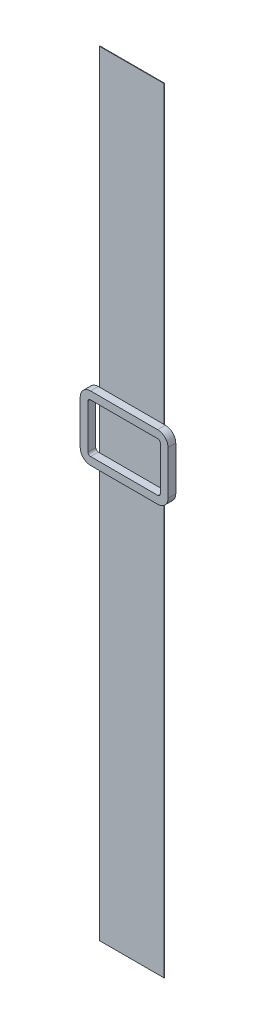
ISO-10303-21;
HEADER;
FILE_DESCRIPTION(('STEP AP214'),'2;1');
FILE_NAME('part.step','',(''),(''),'','','');
FILE_SCHEMA(('AUTOMOTIVE_DESIGN { 1 0 10303 214 1 1 1 1 }'));
ENDSEC;
DATA;
#1=APPLICATION_CONTEXT('core data for automotive mechanical design processes');
#2=APPLICATION_PROTOCOL_DEFINITION('international standard','automotive_design',2000,#1);
#3=PRODUCT_CONTEXT('',#1,'mechanical');
#4=PRODUCT('Part','Part','',(#3));
#5=PRODUCT_RELATED_PRODUCT_CATEGORY('part','',(#4));
#6=PRODUCT_DEFINITION_FORMATION('','',#4);
#7=PRODUCT_DEFINITION_CONTEXT('part definition',#1,'design');
#8=PRODUCT_DEFINITION('design','',#6,#7);
#9=PRODUCT_DEFINITION_SHAPE('','',#8);
#10=(LENGTH_UNIT() NAMED_UNIT(*) SI_UNIT(.MILLI.,.METRE.));
#11=(NAMED_UNIT(*) PLANE_ANGLE_UNIT() SI_UNIT($,.RADIAN.));
#12=(NAMED_UNIT(*) SI_UNIT($,.STERADIAN.) SOLID_ANGLE_UNIT());
#13=UNCERTAINTY_MEASURE_WITH_UNIT(LENGTH_MEASURE(1.E-05),#10,'distance_accuracy_value','');
#14=(GEOMETRIC_REPRESENTATION_CONTEXT(3) GLOBAL_UNCERTAINTY_ASSIGNED_CONTEXT((#13)) GLOBAL_UNIT_ASSIGNED_CONTEXT((#10,
#11,#12)) REPRESENTATION_CONTEXT('',''));
#15=CARTESIAN_POINT('',(0.,0.,0.));
#16=DIRECTION('',(0.,0.,1.));
#17=DIRECTION('',(1.,0.,0.));
#18=AXIS2_PLACEMENT_3D('',#15,#16,#17);
#19=CARTESIAN_POINT('',(0.,300.,0.2));
#20=DIRECTION('',(0.,0.,-1.));
#21=DIRECTION('',(-1.,0.,0.));
#22=AXIS2_PLACEMENT_3D('',#19,#20,#21);
#23=PLANE('',#22);
#24=DIRECTION('',(-1.,0.,0.));
#25=VECTOR('',#24,1.);
#26=CARTESIAN_POINT('',(-0.499999999999997,185.652949425216,0.2));
#27=LINE('',#26,#25);
#28=CARTESIAN_POINT('',(25.,185.652949425217,0.2));
#29=VERTEX_POINT('',#28);
#30=CARTESIAN_POINT('',(0.,185.652949425216,0.2));
#31=VERTEX_POINT('',#30);
#32=EDGE_CURVE('E11',#29,#31,#27,.T.);
#33=ORIENTED_EDGE('',*,*,#32,.F.);
#34=DIRECTION('',(0.,1.,0.));
#35=VECTOR('',#34,1.);
#36=CARTESIAN_POINT('',(25.,0.,0.2));
#37=LINE('',#36,#35);
#38=CARTESIAN_POINT('',(25.,300.,0.2));
#39=VERTEX_POINT('',#38);
#40=EDGE_CURVE('E337',#29,#39,#37,.T.);
#41=ORIENTED_EDGE('',*,*,#40,.T.);
#42=DIRECTION('',(-1.,0.,0.));
#43=VECTOR('',#42,1.);
#44=CARTESIAN_POINT('',(0.,300.,0.2));
#45=LINE('',#44,#43);
#46=CARTESIAN_POINT('',(0.,300.,0.2));
#47=VERTEX_POINT('',#46);
#48=EDGE_CURVE('E341',#39,#47,#45,.T.);
#49=ORIENTED_EDGE('',*,*,#48,.T.);
#50=DIRECTION('',(0.,-1.,0.));
#51=VECTOR('',#50,1.);
#52=CARTESIAN_POINT('',(0.,0.,0.2));
#53=LINE('',#52,#51);
#54=EDGE_CURVE('E330',#47,#31,#53,.T.);
#55=ORIENTED_EDGE('',*,*,#54,.T.);
#56=EDGE_LOOP('',(#33,#41,#49,#55));
#57=FACE_BOUND('',#56,.T.);
#58=ADVANCED_FACE('F32',(#57),#23,.F.);
#59=DIRECTION('',(1.,0.,0.));
#60=VECTOR('',#59,1.);
#61=CARTESIAN_POINT('',(-0.5,160.652949425216,0.2));
#62=LINE('',#61,#60);
#63=CARTESIAN_POINT('',(0.,160.652949425216,0.2));
#64=VERTEX_POINT('',#63);
#65=CARTESIAN_POINT('',(25.,160.652949425217,0.2));
#66=VERTEX_POINT('',#65);
#67=EDGE_CURVE('E41',#64,#66,#62,.T.);
#68=ORIENTED_EDGE('',*,*,#67,.F.);
#69=CARTESIAN_POINT('',(0.,0.,0.2));
#70=VERTEX_POINT('',#69);
#71=EDGE_CURVE('E335',#64,#70,#53,.T.);
#72=ORIENTED_EDGE('',*,*,#71,.T.);
#73=DIRECTION('',(1.,0.,0.));
#74=VECTOR('',#73,1.);
#75=CARTESIAN_POINT('',(0.,0.,0.2));
#76=LINE('',#75,#74);
#77=CARTESIAN_POINT('',(25.,0.,0.2));
#78=VERTEX_POINT('',#77);
#79=EDGE_CURVE('E333',#70,#78,#76,.T.);
#80=ORIENTED_EDGE('',*,*,#79,.T.);
#81=EDGE_CURVE('E338',#78,#66,#37,.T.);
#82=ORIENTED_EDGE('',*,*,#81,.T.);
#83=EDGE_LOOP('',(#68,#72,#80,#82));
#84=FACE_BOUND('',#83,.T.);
#85=ADVANCED_FACE('F430',(#84),#23,.F.);
#86=CARTESIAN_POINT('',(0.,0.,0.2));
#87=DIRECTION('',(1.,0.,0.));
#88=DIRECTION('',(0.,0.,-1.));
#89=AXIS2_PLACEMENT_3D('',#86,#87,#88);
#90=PLANE('',#89);
#91=DIRECTION('',(0.,-1.,0.));
#92=VECTOR('',#91,1.);
#93=CARTESIAN_POINT('',(0.,0.,0.));
#94=LINE('',#93,#92);
#95=CARTESIAN_POINT('',(0.,300.,0.));
#96=VERTEX_POINT('',#95);
#97=CARTESIAN_POINT('',(0.,0.,0.));
#98=VERTEX_POINT('',#97);
#99=EDGE_CURVE('E329',#96,#98,#94,.T.);
#100=ORIENTED_EDGE('',*,*,#99,.T.);
#101=DIRECTION('',(0.,0.,-1.));
#102=VECTOR('',#101,1.);
#103=CARTESIAN_POINT('',(0.,0.,0.2));
#104=LINE('',#103,#102);
#105=EDGE_CURVE('E36',#70,#98,#104,.T.);
#106=ORIENTED_EDGE('',*,*,#105,.F.);
#107=ORIENTED_EDGE('',*,*,#71,.F.);
#108=CARTESIAN_POINT('',(0.,163.652949425216,0.2));
#109=VERTEX_POINT('',#108);
#110=EDGE_CURVE('E401',#109,#64,#53,.T.);
#111=ORIENTED_EDGE('',*,*,#110,.F.);
#112=CARTESIAN_POINT('',(0.,182.652949425216,0.2));
#113=VERTEX_POINT('',#112);
#114=EDGE_CURVE('E404',#113,#109,#53,.T.);
#115=ORIENTED_EDGE('',*,*,#114,.F.);
#116=EDGE_CURVE('E334',#31,#113,#53,.T.);
#117=ORIENTED_EDGE('',*,*,#116,.F.);
#118=ORIENTED_EDGE('',*,*,#54,.F.);
#119=DIRECTION('',(0.,0.,-1.));
#120=VECTOR('',#119,1.);
#121=CARTESIAN_POINT('',(0.,300.,0.2));
#122=LINE('',#121,#120);
#123=EDGE_CURVE('E344',#47,#96,#122,.T.);
#124=ORIENTED_EDGE('',*,*,#123,.T.);
#125=EDGE_LOOP('',(#100,#106,#107,#111,#115,#117,#118,#124));
#126=FACE_BOUND('',#125,.T.);
#127=ADVANCED_FACE('F34',(#126),#90,.F.);
#128=CARTESIAN_POINT('',(0.,0.,0.2));
#129=DIRECTION('',(0.,1.,0.));
#130=DIRECTION('',(0.,0.,1.));
#131=AXIS2_PLACEMENT_3D('',#128,#129,#130);
#132=PLANE('',#131);
#133=DIRECTION('',(1.,0.,0.));
#134=VECTOR('',#133,1.);
#135=CARTESIAN_POINT('',(0.,0.,0.));
#136=LINE('',#135,#134);
#137=CARTESIAN_POINT('',(25.,0.,0.));
#138=VERTEX_POINT('',#137);
#139=EDGE_CURVE('E347',#98,#138,#136,.T.);
#140=ORIENTED_EDGE('',*,*,#139,.T.);
#141=DIRECTION('',(0.,0.,-1.));
#142=VECTOR('',#141,1.);
#143=CARTESIAN_POINT('',(25.,0.,0.2));
#144=LINE('',#143,#142);
#145=EDGE_CURVE('E357',#78,#138,#144,.T.);
#146=ORIENTED_EDGE('',*,*,#145,.F.);
#147=ORIENTED_EDGE('',*,*,#79,.F.);
#148=ORIENTED_EDGE('',*,*,#105,.T.);
#149=EDGE_LOOP('',(#140,#146,#147,#148));
#150=FACE_BOUND('',#149,.T.);
#151=ADVANCED_FACE('F427',(#150),#132,.F.);
#152=CARTESIAN_POINT('',(25.,0.,0.2));
#153=DIRECTION('',(-1.,0.,0.));
#154=DIRECTION('',(0.,0.,1.));
#155=AXIS2_PLACEMENT_3D('',#152,#153,#154);
#156=PLANE('',#155);
#157=DIRECTION('',(0.,1.,0.));
#158=VECTOR('',#157,1.);
#159=CARTESIAN_POINT('',(25.,0.,0.));
#160=LINE('',#159,#158);
#161=CARTESIAN_POINT('',(25.,300.,0.));
#162=VERTEX_POINT('',#161);
#163=EDGE_CURVE('E349',#138,#162,#160,.T.);
#164=ORIENTED_EDGE('',*,*,#163,.T.);
#165=DIRECTION('',(0.,0.,-1.));
#166=VECTOR('',#165,1.);
#167=CARTESIAN_POINT('',(25.,300.,0.2));
#168=LINE('',#167,#166);
#169=EDGE_CURVE('E355',#39,#162,#168,.T.);
#170=ORIENTED_EDGE('',*,*,#169,.F.);
#171=ORIENTED_EDGE('',*,*,#40,.F.);
#172=CARTESIAN_POINT('',(25.,182.652949425217,0.2));
#173=VERTEX_POINT('',#172);
#174=EDGE_CURVE('E412',#173,#29,#37,.T.);
#175=ORIENTED_EDGE('',*,*,#174,.F.);
#176=CARTESIAN_POINT('',(25.,163.652949425217,0.2));
#177=VERTEX_POINT('',#176);
#178=EDGE_CURVE('E407',#177,#173,#37,.T.);
#179=ORIENTED_EDGE('',*,*,#178,.F.);
#180=EDGE_CURVE('E342',#66,#177,#37,.T.);
#181=ORIENTED_EDGE('',*,*,#180,.F.);
#182=ORIENTED_EDGE('',*,*,#81,.F.);
#183=ORIENTED_EDGE('',*,*,#145,.T.);
#184=EDGE_LOOP('',(#164,#170,#171,#175,#179,#181,#182,#183));
#185=FACE_BOUND('',#184,.T.);
#186=ADVANCED_FACE('F410',(#185),#156,.F.);
#187=CARTESIAN_POINT('',(0.,300.,0.2));
#188=DIRECTION('',(0.,-1.,0.));
#189=DIRECTION('',(0.,0.,-1.));
#190=AXIS2_PLACEMENT_3D('',#187,#188,#189);
#191=PLANE('',#190);
#192=DIRECTION('',(-1.,0.,0.));
#193=VECTOR('',#192,1.);
#194=CARTESIAN_POINT('',(0.,300.,0.));
#195=LINE('',#194,#193);
#196=EDGE_CURVE('E351',#162,#96,#195,.T.);
#197=ORIENTED_EDGE('',*,*,#196,.T.);
#198=ORIENTED_EDGE('',*,*,#123,.F.);
#199=ORIENTED_EDGE('',*,*,#48,.F.);
#200=ORIENTED_EDGE('',*,*,#169,.T.);
#201=EDGE_LOOP('',(#197,#198,#199,#200));
#202=FACE_BOUND('',#201,.T.);
#203=ADVANCED_FACE('F422',(#202),#191,.F.);
#204=ORIENTED_EDGE('',*,*,#114,.T.);
#205=DIRECTION('',(1.,0.,0.));
#206=VECTOR('',#205,1.);
#207=CARTESIAN_POINT('',(-0.5,163.652949425216,0.2));
#208=LINE('',#207,#206);
#209=EDGE_CURVE('E247',#109,#177,#208,.T.);
#210=ORIENTED_EDGE('',*,*,#209,.T.);
#211=ORIENTED_EDGE('',*,*,#178,.T.);
#212=DIRECTION('',(-1.,0.,0.));
#213=VECTOR('',#212,1.);
#214=CARTESIAN_POINT('',(-0.5,182.652949425216,0.2));
#215=LINE('',#214,#213);
#216=EDGE_CURVE('E258',#173,#113,#215,.T.);
#217=ORIENTED_EDGE('',*,*,#216,.T.);
#218=EDGE_LOOP('',(#204,#210,#211,#217));
#219=FACE_BOUND('',#218,.T.);
#220=ADVANCED_FACE('F405',(#219),#23,.F.);
#221=CARTESIAN_POINT('',(0.,300.,0.));
#222=DIRECTION('',(0.,0.,-1.));
#223=DIRECTION('',(-1.,0.,0.));
#224=AXIS2_PLACEMENT_3D('',#221,#222,#223);
#225=PLANE('',#224);
#226=ORIENTED_EDGE('',*,*,#99,.F.);
#227=ORIENTED_EDGE('',*,*,#196,.F.);
#228=ORIENTED_EDGE('',*,*,#163,.F.);
#229=ORIENTED_EDGE('',*,*,#139,.F.);
#230=EDGE_LOOP('',(#226,#227,#228,#229));
#231=FACE_BOUND('',#230,.T.);
#232=ADVANCED_FACE('F426',(#231),#225,.T.);
#233=CARTESIAN_POINT('',(-0.5,181.652949425216,0.2));
#234=DIRECTION('',(0.,0.,1.));
#235=DIRECTION('',(1.,0.,0.));
#236=AXIS2_PLACEMENT_3D('',#233,#234,#235);
#237=PLANE('',#236);
#238=CARTESIAN_POINT('',(-0.499999999999997,185.652949425216,0.2));
#239=VERTEX_POINT('',#238);
#240=EDGE_CURVE('E44',#31,#239,#27,.T.);
#241=ORIENTED_EDGE('',*,*,#240,.F.);
#242=ORIENTED_EDGE('',*,*,#116,.T.);
#243=CARTESIAN_POINT('',(-0.5,182.652949425216,0.2));
#244=VERTEX_POINT('',#243);
#245=EDGE_CURVE('E59',#113,#244,#215,.T.);
#246=ORIENTED_EDGE('',*,*,#245,.T.);
#247=CARTESIAN_POINT('',(-0.5,181.652949425216,0.2));
#248=DIRECTION('',(0.,0.,1.));
#249=DIRECTION('',(1.,0.,0.));
#250=AXIS2_PLACEMENT_3D('',#247,#248,#249);
#251=CIRCLE('',#250,1.);
#252=CARTESIAN_POINT('',(-1.5,181.652949425216,0.2));
#253=VERTEX_POINT('',#252);
#254=EDGE_CURVE('E237',#244,#253,#251,.T.);
#255=ORIENTED_EDGE('',*,*,#254,.T.);
#256=DIRECTION('',(0.,-1.,0.));
#257=VECTOR('',#256,1.);
#258=CARTESIAN_POINT('',(-1.5,181.652949425216,0.2));
#259=LINE('',#258,#257);
#260=CARTESIAN_POINT('',(-1.5,164.652949425216,0.2));
#261=VERTEX_POINT('',#260);
#262=EDGE_CURVE('E215',#253,#261,#259,.T.);
#263=ORIENTED_EDGE('',*,*,#262,.T.);
#264=CARTESIAN_POINT('',(-0.5,164.652949425216,0.2));
#265=DIRECTION('',(0.,0.,1.));
#266=DIRECTION('',(1.,0.,0.));
#267=AXIS2_PLACEMENT_3D('',#264,#265,#266);
#268=CIRCLE('',#267,1.);
#269=CARTESIAN_POINT('',(-0.5,163.652949425216,0.2));
#270=VERTEX_POINT('',#269);
#271=EDGE_CURVE('E240',#261,#270,#268,.T.);
#272=ORIENTED_EDGE('',*,*,#271,.T.);
#273=EDGE_CURVE('E243',#270,#109,#208,.T.);
#274=ORIENTED_EDGE('',*,*,#273,.T.);
#275=ORIENTED_EDGE('',*,*,#110,.T.);
#276=CARTESIAN_POINT('',(-0.5,160.652949425216,0.2));
#277=VERTEX_POINT('',#276);
#278=EDGE_CURVE('E296',#277,#64,#62,.T.);
#279=ORIENTED_EDGE('',*,*,#278,.F.);
#280=CARTESIAN_POINT('',(-0.5,164.652949425216,0.2));
#281=DIRECTION('',(0.,0.,1.));
#282=DIRECTION('',(1.,0.,0.));
#283=AXIS2_PLACEMENT_3D('',#280,#281,#282);
#284=CIRCLE('',#283,4.);
#285=CARTESIAN_POINT('',(-4.5,164.652949425216,0.2));
#286=VERTEX_POINT('',#285);
#287=EDGE_CURVE('E293',#286,#277,#284,.T.);
#288=ORIENTED_EDGE('',*,*,#287,.F.);
#289=DIRECTION('',(0.,-1.,0.));
#290=VECTOR('',#289,1.);
#291=CARTESIAN_POINT('',(-4.5,181.652949425216,0.2));
#292=LINE('',#291,#290);
#293=CARTESIAN_POINT('',(-4.5,181.652949425216,0.2));
#294=VERTEX_POINT('',#293);
#295=EDGE_CURVE('E291',#294,#286,#292,.T.);
#296=ORIENTED_EDGE('',*,*,#295,.F.);
#297=CARTESIAN_POINT('',(-0.5,181.652949425216,0.2));
#298=DIRECTION('',(0.,0.,1.));
#299=DIRECTION('',(1.,0.,0.));
#300=AXIS2_PLACEMENT_3D('',#297,#298,#299);
#301=CIRCLE('',#300,4.);
#302=EDGE_CURVE('E216',#239,#294,#301,.T.);
#303=ORIENTED_EDGE('',*,*,#302,.F.);
#304=EDGE_LOOP('',(#241,#242,#246,#255,#263,#272,#274,#275,#279,#288,#296,#303));
#305=FACE_BOUND('',#304,.T.);
#306=ADVANCED_FACE('F374',(#305),#237,.F.);
#307=CARTESIAN_POINT('',(25.5,160.652949425217,0.2));
#308=VERTEX_POINT('',#307);
#309=EDGE_CURVE('E295',#66,#308,#62,.T.);
#310=ORIENTED_EDGE('',*,*,#309,.F.);
#311=ORIENTED_EDGE('',*,*,#180,.T.);
#312=CARTESIAN_POINT('',(25.5,163.652949425217,0.2));
#313=VERTEX_POINT('',#312);
#314=EDGE_CURVE('E51',#177,#313,#208,.T.);
#315=ORIENTED_EDGE('',*,*,#314,.T.);
#316=CARTESIAN_POINT('',(25.5,164.652949425217,0.2));
#317=DIRECTION('',(0.,0.,1.));
#318=DIRECTION('',(-1.,0.,0.));
#319=AXIS2_PLACEMENT_3D('',#316,#317,#318);
#320=CIRCLE('',#319,1.);
#321=CARTESIAN_POINT('',(26.5,164.652949425217,0.2));
#322=VERTEX_POINT('',#321);
#323=EDGE_CURVE('E246',#313,#322,#320,.T.);
#324=ORIENTED_EDGE('',*,*,#323,.T.);
#325=DIRECTION('',(0.,1.,0.));
#326=VECTOR('',#325,1.);
#327=CARTESIAN_POINT('',(26.5,181.652949425217,0.2));
#328=LINE('',#327,#326);
#329=CARTESIAN_POINT('',(26.5,181.652949425217,0.2));
#330=VERTEX_POINT('',#329);
#331=EDGE_CURVE('E250',#322,#330,#328,.T.);
#332=ORIENTED_EDGE('',*,*,#331,.T.);
#333=CARTESIAN_POINT('',(25.5,181.652949425217,0.2));
#334=DIRECTION('',(0.,0.,1.));
#335=DIRECTION('',(-1.,0.,0.));
#336=AXIS2_PLACEMENT_3D('',#333,#334,#335);
#337=CIRCLE('',#336,1.);
#338=CARTESIAN_POINT('',(25.5,182.652949425217,0.2));
#339=VERTEX_POINT('',#338);
#340=EDGE_CURVE('E253',#330,#339,#337,.T.);
#341=ORIENTED_EDGE('',*,*,#340,.T.);
#342=EDGE_CURVE('E209',#339,#173,#215,.T.);
#343=ORIENTED_EDGE('',*,*,#342,.T.);
#344=ORIENTED_EDGE('',*,*,#174,.T.);
#345=CARTESIAN_POINT('',(25.5,185.652949425217,0.2));
#346=VERTEX_POINT('',#345);
#347=EDGE_CURVE('E43',#346,#29,#27,.T.);
#348=ORIENTED_EDGE('',*,*,#347,.F.);
#349=CARTESIAN_POINT('',(25.5,181.652949425217,0.2));
#350=DIRECTION('',(0.,0.,1.));
#351=DIRECTION('',(-1.,0.,0.));
#352=AXIS2_PLACEMENT_3D('',#349,#350,#351);
#353=CIRCLE('',#352,4.);
#354=CARTESIAN_POINT('',(29.5,181.652949425217,0.2));
#355=VERTEX_POINT('',#354);
#356=EDGE_CURVE('E303',#355,#346,#353,.T.);
#357=ORIENTED_EDGE('',*,*,#356,.F.);
#358=DIRECTION('',(0.,1.,0.));
#359=VECTOR('',#358,1.);
#360=CARTESIAN_POINT('',(29.5,181.652949425217,0.2));
#361=LINE('',#360,#359);
#362=CARTESIAN_POINT('',(29.5,164.652949425217,0.2));
#363=VERTEX_POINT('',#362);
#364=EDGE_CURVE('E301',#363,#355,#361,.T.);
#365=ORIENTED_EDGE('',*,*,#364,.F.);
#366=CARTESIAN_POINT('',(25.5,164.652949425217,0.2));
#367=DIRECTION('',(0.,0.,1.));
#368=DIRECTION('',(-1.,0.,0.));
#369=AXIS2_PLACEMENT_3D('',#366,#367,#368);
#370=CIRCLE('',#369,4.);
#371=EDGE_CURVE('E299',#308,#363,#370,.T.);
#372=ORIENTED_EDGE('',*,*,#371,.F.);
#373=EDGE_LOOP('',(#310,#311,#315,#324,#332,#341,#343,#344,#348,#357,#365,#372));
#374=FACE_BOUND('',#373,.T.);
#375=ADVANCED_FACE('F442',(#374),#237,.F.);
#376=CARTESIAN_POINT('',(-0.5,181.652949425216,3.2));
#377=DIRECTION('',(0.,0.,1.));
#378=DIRECTION('',(1.,0.,0.));
#379=AXIS2_PLACEMENT_3D('',#376,#377,#378);
#380=PLANE('',#379);
#381=CARTESIAN_POINT('',(-0.5,181.652949425216,3.2));
#382=DIRECTION('',(0.,0.,1.));
#383=DIRECTION('',(1.,0.,0.));
#384=AXIS2_PLACEMENT_3D('',#381,#382,#383);
#385=CIRCLE('',#384,4.);
#386=CARTESIAN_POINT('',(-0.499999999999997,185.652949425216,3.2));
#387=VERTEX_POINT('',#386);
#388=CARTESIAN_POINT('',(-4.5,181.652949425216,3.2));
#389=VERTEX_POINT('',#388);
#390=EDGE_CURVE('E271',#387,#389,#385,.T.);
#391=ORIENTED_EDGE('',*,*,#390,.T.);
#392=DIRECTION('',(0.,-1.,0.));
#393=VECTOR('',#392,1.);
#394=CARTESIAN_POINT('',(-4.5,181.652949425216,3.2));
#395=LINE('',#394,#393);
#396=CARTESIAN_POINT('',(-4.5,164.652949425216,3.2));
#397=VERTEX_POINT('',#396);
#398=EDGE_CURVE('E274',#389,#397,#395,.T.);
#399=ORIENTED_EDGE('',*,*,#398,.T.);
#400=CARTESIAN_POINT('',(-0.5,164.652949425216,3.2));
#401=DIRECTION('',(0.,0.,1.));
#402=DIRECTION('',(1.,0.,0.));
#403=AXIS2_PLACEMENT_3D('',#400,#401,#402);
#404=CIRCLE('',#403,4.);
#405=CARTESIAN_POINT('',(-0.5,160.652949425216,3.2));
#406=VERTEX_POINT('',#405);
#407=EDGE_CURVE('E276',#397,#406,#404,.T.);
#408=ORIENTED_EDGE('',*,*,#407,.T.);
#409=DIRECTION('',(1.,0.,0.));
#410=VECTOR('',#409,1.);
#411=CARTESIAN_POINT('',(-0.5,160.652949425216,3.2));
#412=LINE('',#411,#410);
#413=CARTESIAN_POINT('',(25.5,160.652949425217,3.2));
#414=VERTEX_POINT('',#413);
#415=EDGE_CURVE('E278',#406,#414,#412,.T.);
#416=ORIENTED_EDGE('',*,*,#415,.T.);
#417=CARTESIAN_POINT('',(25.5,164.652949425217,3.2));
#418=DIRECTION('',(0.,0.,1.));
#419=DIRECTION('',(-1.,0.,0.));
#420=AXIS2_PLACEMENT_3D('',#417,#418,#419);
#421=CIRCLE('',#420,4.);
#422=CARTESIAN_POINT('',(29.5,164.652949425217,3.2));
#423=VERTEX_POINT('',#422);
#424=EDGE_CURVE('E280',#414,#423,#421,.T.);
#425=ORIENTED_EDGE('',*,*,#424,.T.);
#426=DIRECTION('',(0.,1.,0.));
#427=VECTOR('',#426,1.);
#428=CARTESIAN_POINT('',(29.5,181.652949425217,3.2));
#429=LINE('',#428,#427);
#430=CARTESIAN_POINT('',(29.5,181.652949425217,3.2));
#431=VERTEX_POINT('',#430);
#432=EDGE_CURVE('E282',#423,#431,#429,.T.);
#433=ORIENTED_EDGE('',*,*,#432,.T.);
#434=CARTESIAN_POINT('',(25.5,181.652949425217,3.2));
#435=DIRECTION('',(0.,0.,1.));
#436=DIRECTION('',(-1.,0.,0.));
#437=AXIS2_PLACEMENT_3D('',#434,#435,#436);
#438=CIRCLE('',#437,4.);
#439=CARTESIAN_POINT('',(25.5,185.652949425217,3.2));
#440=VERTEX_POINT('',#439);
#441=EDGE_CURVE('E284',#431,#440,#438,.T.);
#442=ORIENTED_EDGE('',*,*,#441,.T.);
#443=DIRECTION('',(-1.,0.,0.));
#444=VECTOR('',#443,1.);
#445=CARTESIAN_POINT('',(-0.499999999999997,185.652949425216,3.2));
#446=LINE('',#445,#444);
#447=EDGE_CURVE('E286',#440,#387,#446,.T.);
#448=ORIENTED_EDGE('',*,*,#447,.T.);
#449=EDGE_LOOP('',(#391,#399,#408,#416,#425,#433,#442,#448));
#450=FACE_BOUND('',#449,.T.);
#451=DIRECTION('',(0.,-1.,0.));
#452=VECTOR('',#451,1.);
#453=CARTESIAN_POINT('',(-1.5,181.652949425216,3.2));
#454=LINE('',#453,#452);
#455=CARTESIAN_POINT('',(-1.5,181.652949425216,3.2));
#456=VERTEX_POINT('',#455);
#457=CARTESIAN_POINT('',(-1.5,164.652949425216,3.2));
#458=VERTEX_POINT('',#457);
#459=EDGE_CURVE('E208',#456,#458,#454,.T.);
#460=ORIENTED_EDGE('',*,*,#459,.F.);
#461=CARTESIAN_POINT('',(-0.5,181.652949425216,3.2));
#462=DIRECTION('',(0.,0.,1.));
#463=DIRECTION('',(1.,0.,0.));
#464=AXIS2_PLACEMENT_3D('',#461,#462,#463);
#465=CIRCLE('',#464,1.);
#466=CARTESIAN_POINT('',(-0.5,182.652949425216,3.2));
#467=VERTEX_POINT('',#466);
#468=EDGE_CURVE('E198',#467,#456,#465,.T.);
#469=ORIENTED_EDGE('',*,*,#468,.F.);
#470=DIRECTION('',(-1.,0.,0.));
#471=VECTOR('',#470,1.);
#472=CARTESIAN_POINT('',(-0.5,182.652949425216,3.2));
#473=LINE('',#472,#471);
#474=CARTESIAN_POINT('',(25.5,182.652949425217,3.2));
#475=VERTEX_POINT('',#474);
#476=EDGE_CURVE('E235',#475,#467,#473,.T.);
#477=ORIENTED_EDGE('',*,*,#476,.F.);
#478=CARTESIAN_POINT('',(25.5,181.652949425217,3.2));
#479=DIRECTION('',(0.,0.,1.));
#480=DIRECTION('',(-1.,0.,0.));
#481=AXIS2_PLACEMENT_3D('',#478,#479,#480);
#482=CIRCLE('',#481,1.);
#483=CARTESIAN_POINT('',(26.5,181.652949425217,3.2));
#484=VERTEX_POINT('',#483);
#485=EDGE_CURVE('E232',#484,#475,#482,.T.);
#486=ORIENTED_EDGE('',*,*,#485,.F.);
#487=DIRECTION('',(0.,1.,0.));
#488=VECTOR('',#487,1.);
#489=CARTESIAN_POINT('',(26.5,181.652949425217,3.2));
#490=LINE('',#489,#488);
#491=CARTESIAN_POINT('',(26.5,164.652949425217,3.2));
#492=VERTEX_POINT('',#491);
#493=EDGE_CURVE('E230',#492,#484,#490,.T.);
#494=ORIENTED_EDGE('',*,*,#493,.F.);
#495=CARTESIAN_POINT('',(25.5,164.652949425217,3.2));
#496=DIRECTION('',(0.,0.,1.));
#497=DIRECTION('',(-1.,0.,0.));
#498=AXIS2_PLACEMENT_3D('',#495,#496,#497);
#499=CIRCLE('',#498,1.);
#500=CARTESIAN_POINT('',(25.5,163.652949425217,3.2));
#501=VERTEX_POINT('',#500);
#502=EDGE_CURVE('E228',#501,#492,#499,.T.);
#503=ORIENTED_EDGE('',*,*,#502,.F.);
#504=DIRECTION('',(1.,0.,0.));
#505=VECTOR('',#504,1.);
#506=CARTESIAN_POINT('',(-0.5,163.652949425216,3.2));
#507=LINE('',#506,#505);
#508=CARTESIAN_POINT('',(-0.5,163.652949425216,3.2));
#509=VERTEX_POINT('',#508);
#510=EDGE_CURVE('E224',#509,#501,#507,.T.);
#511=ORIENTED_EDGE('',*,*,#510,.F.);
#512=CARTESIAN_POINT('',(-0.5,164.652949425216,3.2));
#513=DIRECTION('',(0.,0.,1.));
#514=DIRECTION('',(1.,0.,0.));
#515=AXIS2_PLACEMENT_3D('',#512,#513,#514);
#516=CIRCLE('',#515,1.);
#517=EDGE_CURVE('E222',#458,#509,#516,.T.);
#518=ORIENTED_EDGE('',*,*,#517,.F.);
#519=EDGE_LOOP('',(#460,#469,#477,#486,#494,#503,#511,#518));
#520=FACE_BOUND('',#519,.T.);
#521=ADVANCED_FACE('F220',(#450,#520),#380,.T.);
#522=CARTESIAN_POINT('',(-0.5,181.652949425216,3.2));
#523=DIRECTION('',(0.,0.,-1.));
#524=DIRECTION('',(-1.,0.,0.));
#525=AXIS2_PLACEMENT_3D('',#522,#523,#524);
#526=CYLINDRICAL_SURFACE('',#525,4.);
#527=ORIENTED_EDGE('',*,*,#302,.T.);
#528=DIRECTION('',(0.,0.,-1.));
#529=VECTOR('',#528,1.);
#530=CARTESIAN_POINT('',(-4.5,181.652949425216,3.2));
#531=LINE('',#530,#529);
#532=EDGE_CURVE('E326',#389,#294,#531,.T.);
#533=ORIENTED_EDGE('',*,*,#532,.F.);
#534=ORIENTED_EDGE('',*,*,#390,.F.);
#535=DIRECTION('',(0.,0.,-1.));
#536=VECTOR('',#535,1.);
#537=CARTESIAN_POINT('',(-0.499999999999997,185.652949425216,3.2));
#538=LINE('',#537,#536);
#539=EDGE_CURVE('E288',#387,#239,#538,.T.);
#540=ORIENTED_EDGE('',*,*,#539,.T.);
#541=EDGE_LOOP('',(#527,#533,#534,#540));
#542=FACE_BOUND('',#541,.T.);
#543=ADVANCED_FACE('F467',(#542),#526,.T.);
#544=CARTESIAN_POINT('',(-4.5,181.652949425216,3.2));
#545=DIRECTION('',(1.,0.,0.));
#546=DIRECTION('',(0.,0.,-1.));
#547=AXIS2_PLACEMENT_3D('',#544,#545,#546);
#548=PLANE('',#547);
#549=ORIENTED_EDGE('',*,*,#295,.T.);
#550=DIRECTION('',(0.,0.,-1.));
#551=VECTOR('',#550,1.);
#552=CARTESIAN_POINT('',(-4.5,164.652949425216,3.2));
#553=LINE('',#552,#551);
#554=EDGE_CURVE('E323',#397,#286,#553,.T.);
#555=ORIENTED_EDGE('',*,*,#554,.F.);
#556=ORIENTED_EDGE('',*,*,#398,.F.);
#557=ORIENTED_EDGE('',*,*,#532,.T.);
#558=EDGE_LOOP('',(#549,#555,#556,#557));
#559=FACE_BOUND('',#558,.T.);
#560=ADVANCED_FACE('F463',(#559),#548,.F.);
#561=CARTESIAN_POINT('',(-0.5,164.652949425216,3.2));
#562=DIRECTION('',(0.,0.,-1.));
#563=DIRECTION('',(-1.,0.,0.));
#564=AXIS2_PLACEMENT_3D('',#561,#562,#563);
#565=CYLINDRICAL_SURFACE('',#564,4.);
#566=ORIENTED_EDGE('',*,*,#287,.T.);
#567=DIRECTION('',(0.,0.,-1.));
#568=VECTOR('',#567,1.);
#569=CARTESIAN_POINT('',(-0.5,160.652949425216,3.2));
#570=LINE('',#569,#568);
#571=EDGE_CURVE('E320',#406,#277,#570,.T.);
#572=ORIENTED_EDGE('',*,*,#571,.F.);
#573=ORIENTED_EDGE('',*,*,#407,.F.);
#574=ORIENTED_EDGE('',*,*,#554,.T.);
#575=EDGE_LOOP('',(#566,#572,#573,#574));
#576=FACE_BOUND('',#575,.T.);
#577=ADVANCED_FACE('F460',(#576),#565,.T.);
#578=CARTESIAN_POINT('',(-0.5,160.652949425216,3.2));
#579=DIRECTION('',(0.,1.,0.));
#580=DIRECTION('',(-1.,0.,0.));
#581=AXIS2_PLACEMENT_3D('',#578,#579,#580);
#582=PLANE('',#581);
#583=ORIENTED_EDGE('',*,*,#278,.T.);
#584=ORIENTED_EDGE('',*,*,#67,.T.);
#585=ORIENTED_EDGE('',*,*,#309,.T.);
#586=DIRECTION('',(0.,0.,-1.));
#587=VECTOR('',#586,1.);
#588=CARTESIAN_POINT('',(25.5,160.652949425217,3.2));
#589=LINE('',#588,#587);
#590=EDGE_CURVE('E317',#414,#308,#589,.T.);
#591=ORIENTED_EDGE('',*,*,#590,.F.);
#592=ORIENTED_EDGE('',*,*,#415,.F.);
#593=ORIENTED_EDGE('',*,*,#571,.T.);
#594=EDGE_LOOP('',(#583,#584,#585,#591,#592,#593));
#595=FACE_BOUND('',#594,.T.);
#596=ADVANCED_FACE('F434',(#595),#582,.F.);
#597=CARTESIAN_POINT('',(25.5,164.652949425217,3.2));
#598=DIRECTION('',(0.,0.,-1.));
#599=DIRECTION('',(-1.,0.,0.));
#600=AXIS2_PLACEMENT_3D('',#597,#598,#599);
#601=CYLINDRICAL_SURFACE('',#600,4.);
#602=ORIENTED_EDGE('',*,*,#371,.T.);
#603=DIRECTION('',(0.,0.,-1.));
#604=VECTOR('',#603,1.);
#605=CARTESIAN_POINT('',(29.5,164.652949425217,3.2));
#606=LINE('',#605,#604);
#607=EDGE_CURVE('E314',#423,#363,#606,.T.);
#608=ORIENTED_EDGE('',*,*,#607,.F.);
#609=ORIENTED_EDGE('',*,*,#424,.F.);
#610=ORIENTED_EDGE('',*,*,#590,.T.);
#611=EDGE_LOOP('',(#602,#608,#609,#610));
#612=FACE_BOUND('',#611,.T.);
#613=ADVANCED_FACE('F439',(#612),#601,.T.);
#614=CARTESIAN_POINT('',(29.5,181.652949425217,3.2));
#615=DIRECTION('',(-1.,0.,0.));
#616=DIRECTION('',(0.,0.,1.));
#617=AXIS2_PLACEMENT_3D('',#614,#615,#616);
#618=PLANE('',#617);
#619=ORIENTED_EDGE('',*,*,#364,.T.);
#620=DIRECTION('',(0.,0.,-1.));
#621=VECTOR('',#620,1.);
#622=CARTESIAN_POINT('',(29.5,181.652949425217,3.2));
#623=LINE('',#622,#621);
#624=EDGE_CURVE('E311',#431,#355,#623,.T.);
#625=ORIENTED_EDGE('',*,*,#624,.F.);
#626=ORIENTED_EDGE('',*,*,#432,.F.);
#627=ORIENTED_EDGE('',*,*,#607,.T.);
#628=EDGE_LOOP('',(#619,#625,#626,#627));
#629=FACE_BOUND('',#628,.T.);
#630=ADVANCED_FACE('F446',(#629),#618,.F.);
#631=CARTESIAN_POINT('',(25.5,181.652949425217,3.2));
#632=DIRECTION('',(0.,0.,-1.));
#633=DIRECTION('',(-1.,0.,0.));
#634=AXIS2_PLACEMENT_3D('',#631,#632,#633);
#635=CYLINDRICAL_SURFACE('',#634,4.);
#636=ORIENTED_EDGE('',*,*,#356,.T.);
#637=DIRECTION('',(0.,0.,-1.));
#638=VECTOR('',#637,1.);
#639=CARTESIAN_POINT('',(25.5,185.652949425217,3.2));
#640=LINE('',#639,#638);
#641=EDGE_CURVE('E308',#440,#346,#640,.T.);
#642=ORIENTED_EDGE('',*,*,#641,.F.);
#643=ORIENTED_EDGE('',*,*,#441,.F.);
#644=ORIENTED_EDGE('',*,*,#624,.T.);
#645=EDGE_LOOP('',(#636,#642,#643,#644));
#646=FACE_BOUND('',#645,.T.);
#647=ADVANCED_FACE('F450',(#646),#635,.T.);
#648=CARTESIAN_POINT('',(-0.499999999999997,185.652949425216,3.2));
#649=DIRECTION('',(0.,-1.,0.));
#650=DIRECTION('',(1.,0.,0.));
#651=AXIS2_PLACEMENT_3D('',#648,#649,#650);
#652=PLANE('',#651);
#653=ORIENTED_EDGE('',*,*,#347,.T.);
#654=ORIENTED_EDGE('',*,*,#32,.T.);
#655=ORIENTED_EDGE('',*,*,#240,.T.);
#656=ORIENTED_EDGE('',*,*,#539,.F.);
#657=ORIENTED_EDGE('',*,*,#447,.F.);
#658=ORIENTED_EDGE('',*,*,#641,.T.);
#659=EDGE_LOOP('',(#653,#654,#655,#656,#657,#658));
#660=FACE_BOUND('',#659,.T.);
#661=ADVANCED_FACE('F469',(#660),#652,.F.);
#662=CARTESIAN_POINT('',(-0.5,181.652949425216,3.2));
#663=DIRECTION('',(0.,0.,-1.));
#664=DIRECTION('',(-1.,0.,0.));
#665=AXIS2_PLACEMENT_3D('',#662,#663,#664);
#666=CYLINDRICAL_SURFACE('',#665,1.);
#667=ORIENTED_EDGE('',*,*,#254,.F.);
#668=DIRECTION('',(0.,0.,-1.));
#669=VECTOR('',#668,1.);
#670=CARTESIAN_POINT('',(-0.5,182.652949425216,3.2));
#671=LINE('',#670,#669);
#672=EDGE_CURVE('E204',#467,#244,#671,.T.);
#673=ORIENTED_EDGE('',*,*,#672,.F.);
#674=ORIENTED_EDGE('',*,*,#468,.T.);
#675=DIRECTION('',(0.,0.,-1.));
#676=VECTOR('',#675,1.);
#677=CARTESIAN_POINT('',(-1.5,181.652949425216,3.2));
#678=LINE('',#677,#676);
#679=EDGE_CURVE('E202',#456,#253,#678,.T.);
#680=ORIENTED_EDGE('',*,*,#679,.T.);
#681=EDGE_LOOP('',(#667,#673,#674,#680));
#682=FACE_BOUND('',#681,.T.);
#683=ADVANCED_FACE('F201',(#682),#666,.F.);
#684=CARTESIAN_POINT('',(-1.5,181.652949425216,3.2));
#685=DIRECTION('',(1.,0.,0.));
#686=DIRECTION('',(0.,0.,-1.));
#687=AXIS2_PLACEMENT_3D('',#684,#685,#686);
#688=PLANE('',#687);
#689=ORIENTED_EDGE('',*,*,#262,.F.);
#690=ORIENTED_EDGE('',*,*,#679,.F.);
#691=ORIENTED_EDGE('',*,*,#459,.T.);
#692=DIRECTION('',(0.,0.,-1.));
#693=VECTOR('',#692,1.);
#694=CARTESIAN_POINT('',(-1.5,164.652949425216,3.2));
#695=LINE('',#694,#693);
#696=EDGE_CURVE('E217',#458,#261,#695,.T.);
#697=ORIENTED_EDGE('',*,*,#696,.T.);
#698=EDGE_LOOP('',(#689,#690,#691,#697));
#699=FACE_BOUND('',#698,.T.);
#700=ADVANCED_FACE('F212',(#699),#688,.T.);
#701=CARTESIAN_POINT('',(-0.5,164.652949425216,3.2));
#702=DIRECTION('',(0.,0.,-1.));
#703=DIRECTION('',(-1.,0.,0.));
#704=AXIS2_PLACEMENT_3D('',#701,#702,#703);
#705=CYLINDRICAL_SURFACE('',#704,1.);
#706=ORIENTED_EDGE('',*,*,#271,.F.);
#707=ORIENTED_EDGE('',*,*,#696,.F.);
#708=ORIENTED_EDGE('',*,*,#517,.T.);
#709=DIRECTION('',(0.,0.,-1.));
#710=VECTOR('',#709,1.);
#711=CARTESIAN_POINT('',(-0.5,163.652949425216,3.2));
#712=LINE('',#711,#710);
#713=EDGE_CURVE('E268',#509,#270,#712,.T.);
#714=ORIENTED_EDGE('',*,*,#713,.T.);
#715=EDGE_LOOP('',(#706,#707,#708,#714));
#716=FACE_BOUND('',#715,.T.);
#717=ADVANCED_FACE('F398',(#716),#705,.F.);
#718=CARTESIAN_POINT('',(-0.5,163.652949425216,3.2));
#719=DIRECTION('',(0.,1.,0.));
#720=DIRECTION('',(-1.,0.,0.));
#721=AXIS2_PLACEMENT_3D('',#718,#719,#720);
#722=PLANE('',#721);
#723=ORIENTED_EDGE('',*,*,#273,.F.);
#724=ORIENTED_EDGE('',*,*,#713,.F.);
#725=ORIENTED_EDGE('',*,*,#510,.T.);
#726=DIRECTION('',(0.,0.,-1.));
#727=VECTOR('',#726,1.);
#728=CARTESIAN_POINT('',(25.5,163.652949425217,3.2));
#729=LINE('',#728,#727);
#730=EDGE_CURVE('E266',#501,#313,#729,.T.);
#731=ORIENTED_EDGE('',*,*,#730,.T.);
#732=ORIENTED_EDGE('',*,*,#314,.F.);
#733=ORIENTED_EDGE('',*,*,#209,.F.);
#734=EDGE_LOOP('',(#723,#724,#725,#731,#732,#733));
#735=FACE_BOUND('',#734,.T.);
#736=ADVANCED_FACE('F395',(#735),#722,.T.);
#737=CARTESIAN_POINT('',(25.5,164.652949425217,3.2));
#738=DIRECTION('',(0.,0.,-1.));
#739=DIRECTION('',(-1.,0.,0.));
#740=AXIS2_PLACEMENT_3D('',#737,#738,#739);
#741=CYLINDRICAL_SURFACE('',#740,1.);
#742=ORIENTED_EDGE('',*,*,#323,.F.);
#743=ORIENTED_EDGE('',*,*,#730,.F.);
#744=ORIENTED_EDGE('',*,*,#502,.T.);
#745=DIRECTION('',(0.,0.,-1.));
#746=VECTOR('',#745,1.);
#747=CARTESIAN_POINT('',(26.5,164.652949425217,3.2));
#748=LINE('',#747,#746);
#749=EDGE_CURVE('E264',#492,#322,#748,.T.);
#750=ORIENTED_EDGE('',*,*,#749,.T.);
#751=EDGE_LOOP('',(#742,#743,#744,#750));
#752=FACE_BOUND('',#751,.T.);
#753=ADVANCED_FACE('F391',(#752),#741,.F.);
#754=CARTESIAN_POINT('',(26.5,181.652949425217,3.2));
#755=DIRECTION('',(-1.,0.,0.));
#756=DIRECTION('',(0.,0.,1.));
#757=AXIS2_PLACEMENT_3D('',#754,#755,#756);
#758=PLANE('',#757);
#759=ORIENTED_EDGE('',*,*,#331,.F.);
#760=ORIENTED_EDGE('',*,*,#749,.F.);
#761=ORIENTED_EDGE('',*,*,#493,.T.);
#762=DIRECTION('',(0.,0.,-1.));
#763=VECTOR('',#762,1.);
#764=CARTESIAN_POINT('',(26.5,181.652949425217,3.2));
#765=LINE('',#764,#763);
#766=EDGE_CURVE('E262',#484,#330,#765,.T.);
#767=ORIENTED_EDGE('',*,*,#766,.T.);
#768=EDGE_LOOP('',(#759,#760,#761,#767));
#769=FACE_BOUND('',#768,.T.);
#770=ADVANCED_FACE('F387',(#769),#758,.T.);
#771=CARTESIAN_POINT('',(25.5,181.652949425217,3.2));
#772=DIRECTION('',(0.,0.,-1.));
#773=DIRECTION('',(-1.,0.,0.));
#774=AXIS2_PLACEMENT_3D('',#771,#772,#773);
#775=CYLINDRICAL_SURFACE('',#774,1.);
#776=ORIENTED_EDGE('',*,*,#340,.F.);
#777=ORIENTED_EDGE('',*,*,#766,.F.);
#778=ORIENTED_EDGE('',*,*,#485,.T.);
#779=DIRECTION('',(0.,0.,-1.));
#780=VECTOR('',#779,1.);
#781=CARTESIAN_POINT('',(25.5,182.652949425217,3.2));
#782=LINE('',#781,#780);
#783=EDGE_CURVE('E260',#475,#339,#782,.T.);
#784=ORIENTED_EDGE('',*,*,#783,.T.);
#785=EDGE_LOOP('',(#776,#777,#778,#784));
#786=FACE_BOUND('',#785,.T.);
#787=ADVANCED_FACE('F384',(#786),#775,.F.);
#788=CARTESIAN_POINT('',(-0.5,182.652949425216,3.2));
#789=DIRECTION('',(0.,-1.,0.));
#790=DIRECTION('',(1.,0.,0.));
#791=AXIS2_PLACEMENT_3D('',#788,#789,#790);
#792=PLANE('',#791);
#793=ORIENTED_EDGE('',*,*,#342,.F.);
#794=ORIENTED_EDGE('',*,*,#783,.F.);
#795=ORIENTED_EDGE('',*,*,#476,.T.);
#796=ORIENTED_EDGE('',*,*,#672,.T.);
#797=ORIENTED_EDGE('',*,*,#245,.F.);
#798=ORIENTED_EDGE('',*,*,#216,.F.);
#799=EDGE_LOOP('',(#793,#794,#795,#796,#797,#798));
#800=FACE_BOUND('',#799,.T.);
#801=ADVANCED_FACE('F377',(#800),#792,.T.);
#802=CLOSED_SHELL('',(#58,#85,#127,#151,#186,#203,#220,#232,#306,#375,#521,#543,#560,#577,#596,
#613,#630,#647,#661,#683,#700,#717,#736,#753,#770,#787,#801));
#803=MANIFOLD_SOLID_BREP('B2',#802);
#804=ADVANCED_BREP_SHAPE_REPRESENTATION('',(#18,#803),#14);
#805=SHAPE_DEFINITION_REPRESENTATION(#9,#804);
ENDSEC;
END-ISO-10303-21;
